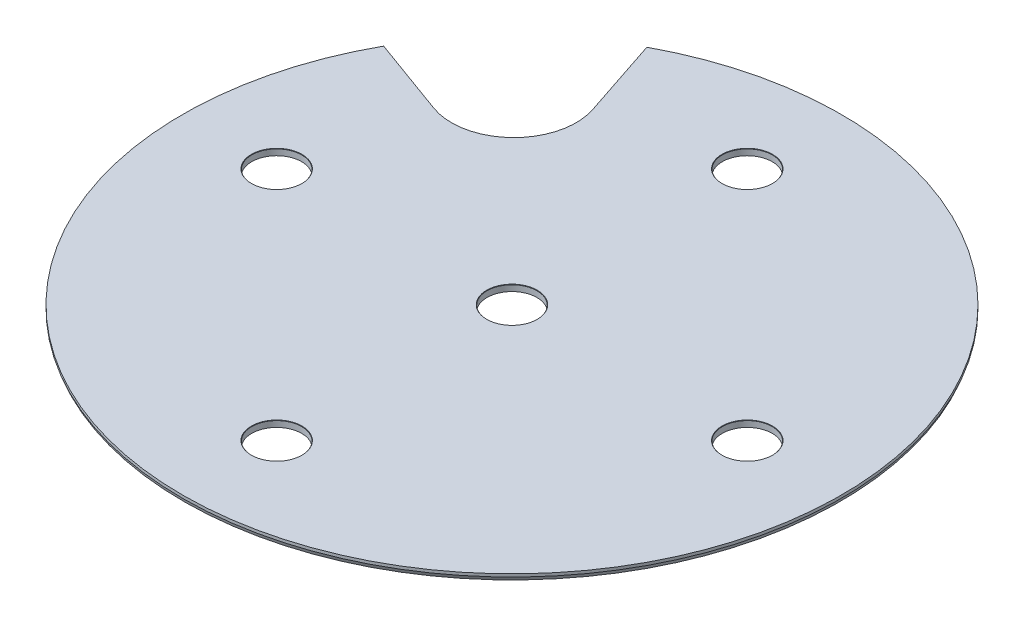
ISO-10303-21;
HEADER;
FILE_DESCRIPTION(('STEP AP214'),'2;1');
FILE_NAME('part.step','',(''),(''),'','','');
FILE_SCHEMA(('AUTOMOTIVE_DESIGN { 1 0 10303 214 1 1 1 1 }'));
ENDSEC;
DATA;
#1=APPLICATION_CONTEXT('core data for automotive mechanical design processes');
#2=APPLICATION_PROTOCOL_DEFINITION('international standard','automotive_design',2000,#1);
#3=PRODUCT_CONTEXT('',#1,'mechanical');
#4=PRODUCT('Part','Part','',(#3));
#5=PRODUCT_RELATED_PRODUCT_CATEGORY('part','',(#4));
#6=PRODUCT_DEFINITION_FORMATION('','',#4);
#7=PRODUCT_DEFINITION_CONTEXT('part definition',#1,'design');
#8=PRODUCT_DEFINITION('design','',#6,#7);
#9=PRODUCT_DEFINITION_SHAPE('','',#8);
#10=(LENGTH_UNIT() NAMED_UNIT(*) SI_UNIT(.MILLI.,.METRE.));
#11=(NAMED_UNIT(*) PLANE_ANGLE_UNIT() SI_UNIT($,.RADIAN.));
#12=(NAMED_UNIT(*) SI_UNIT($,.STERADIAN.) SOLID_ANGLE_UNIT());
#13=UNCERTAINTY_MEASURE_WITH_UNIT(LENGTH_MEASURE(1.E-05),#10,'distance_accuracy_value','');
#14=(GEOMETRIC_REPRESENTATION_CONTEXT(3) GLOBAL_UNCERTAINTY_ASSIGNED_CONTEXT((#13)) GLOBAL_UNIT_ASSIGNED_CONTEXT((#10,
#11,#12)) REPRESENTATION_CONTEXT('',''));
#15=CARTESIAN_POINT('',(0.,0.,0.));
#16=DIRECTION('',(0.,0.,1.));
#17=DIRECTION('',(1.,0.,0.));
#18=AXIS2_PLACEMENT_3D('',#15,#16,#17);
#19=CARTESIAN_POINT('',(0.,0.5,0.));
#20=DIRECTION('',(0.,-1.,0.));
#21=DIRECTION('',(0.,0.,-1.));
#22=AXIS2_PLACEMENT_3D('',#19,#20,#21);
#23=CYLINDRICAL_SURFACE('',#22,26.4);
#24=CARTESIAN_POINT('',(0.,0.5,0.));
#25=DIRECTION('',(0.,1.,0.));
#26=DIRECTION('',(0.,0.,1.));
#27=AXIS2_PLACEMENT_3D('',#24,#25,#26);
#28=CIRCLE('',#27,26.4);
#29=CARTESIAN_POINT('',(-23.0863925837492,0.5,-12.8054081336368));
#30=VERTEX_POINT('',#29);
#31=CARTESIAN_POINT('',(-12.4661036619069,0.5,-23.2713613587729));
#32=VERTEX_POINT('',#31);
#33=EDGE_CURVE('E171',#30,#32,#28,.T.);
#34=ORIENTED_EDGE('',*,*,#33,.F.);
#35=DIRECTION('',(0.,1.,0.));
#36=VECTOR('',#35,1.);
#37=CARTESIAN_POINT('',(-23.0863925837492,0.,-12.8054081336368));
#38=LINE('',#37,#36);
#39=CARTESIAN_POINT('',(-23.0863925837492,0.274747741945441,-12.8054081336368));
#40=VERTEX_POINT('',#39);
#41=EDGE_CURVE('E124',#40,#30,#38,.T.);
#42=ORIENTED_EDGE('',*,*,#41,.F.);
#43=CARTESIAN_POINT('',(0.,0.274747741945441,0.));
#44=DIRECTION('',(0.,1.,0.));
#45=DIRECTION('',(0.,0.,1.));
#46=AXIS2_PLACEMENT_3D('',#43,#44,#45);
#47=CIRCLE('',#46,26.4);
#48=CARTESIAN_POINT('',(-12.4661036619069,0.274747741945441,-23.2713613587729));
#49=VERTEX_POINT('',#48);
#50=EDGE_CURVE('E174',#40,#49,#47,.T.);
#51=ORIENTED_EDGE('',*,*,#50,.T.);
#52=DIRECTION('',(0.,1.,0.));
#53=VECTOR('',#52,1.);
#54=CARTESIAN_POINT('',(-12.4661036619069,0.,-23.2713613587729));
#55=LINE('',#54,#53);
#56=EDGE_CURVE('E62',#49,#32,#55,.T.);
#57=ORIENTED_EDGE('',*,*,#56,.T.);
#58=EDGE_LOOP('',(#34,#42,#51,#57));
#59=FACE_BOUND('',#58,.T.);
#60=ADVANCED_FACE('F40',(#59),#23,.T.);
#61=CARTESIAN_POINT('',(0.,0.5,0.));
#62=DIRECTION('',(0.,1.,0.));
#63=DIRECTION('',(0.,0.,1.));
#64=AXIS2_PLACEMENT_3D('',#61,#62,#63);
#65=PLANE('',#64);
#66=DIRECTION('',(0.939872835093915,0.,0.341524602118979));
#67=VECTOR('',#66,1.);
#68=CARTESIAN_POINT('',(1.41762907674872,0.5,-3.90130330643418));
#69=LINE('',#68,#67);
#70=CARTESIAN_POINT('',(-16.7640237019021,0.5,-10.5080287050608));
#71=VERTEX_POINT('',#70);
#72=EDGE_CURVE('E112',#30,#71,#69,.T.);
#73=ORIENTED_EDGE('',*,*,#72,.F.);
#74=ORIENTED_EDGE('',*,*,#33,.T.);
#75=DIRECTION('',(-0.315197196171202,0.,-0.949026199599259));
#76=VECTOR('',#75,1.);
#77=CARTESIAN_POINT('',(-4.26643376571832,0.5,1.41699771952809));
#78=LINE('',#77,#76);
#79=CARTESIAN_POINT('',(-10.3112696933109,0.5,-16.7833788613863));
#80=VERTEX_POINT('',#79);
#81=EDGE_CURVE('E115',#80,#32,#78,.T.);
#82=ORIENTED_EDGE('',*,*,#81,.F.);
#83=CARTESIAN_POINT('',(-15.0564006913072,0.5,-15.2073928805303));
#84=DIRECTION('',(0.,1.,0.));
#85=DIRECTION('',(0.,0.,1.));
#86=AXIS2_PLACEMENT_3D('',#83,#84,#85);
#87=CIRCLE('',#86,5.);
#88=EDGE_CURVE('E99',#71,#80,#87,.T.);
#89=ORIENTED_EDGE('',*,*,#88,.F.);
#90=EDGE_LOOP('',(#73,#74,#82,#89));
#91=FACE_BOUND('',#90,.T.);
#92=CARTESIAN_POINT('',(-18.85,0.500000000000002,0.));
#93=DIRECTION('',(0.,1.,0.));
#94=DIRECTION('',(0.,0.,1.));
#95=AXIS2_PLACEMENT_3D('',#92,#93,#94);
#96=CIRCLE('',#95,2.025);
#97=CARTESIAN_POINT('',(-18.85,0.500000000000002,2.025));
#98=VERTEX_POINT('',#97);
#99=EDGE_CURVE('E123',#98,#98,#96,.T.);
#100=ORIENTED_EDGE('',*,*,#99,.F.);
#101=EDGE_LOOP('',(#100));
#102=FACE_BOUND('',#101,.T.);
#103=CARTESIAN_POINT('',(0.,0.500000000000002,-18.85));
#104=DIRECTION('',(0.,1.,0.));
#105=DIRECTION('',(0.,0.,1.));
#106=AXIS2_PLACEMENT_3D('',#103,#104,#105);
#107=CIRCLE('',#106,2.025);
#108=CARTESIAN_POINT('',(0.,0.500000000000002,-16.825));
#109=VERTEX_POINT('',#108);
#110=EDGE_CURVE('E135',#109,#109,#107,.T.);
#111=ORIENTED_EDGE('',*,*,#110,.F.);
#112=EDGE_LOOP('',(#111));
#113=FACE_BOUND('',#112,.T.);
#114=CARTESIAN_POINT('',(18.85,0.500000000000002,1.31628846474386E-13));
#115=DIRECTION('',(0.,1.,0.));
#116=DIRECTION('',(0.,0.,1.));
#117=AXIS2_PLACEMENT_3D('',#114,#115,#116);
#118=CIRCLE('',#117,2.025);
#119=CARTESIAN_POINT('',(18.85,0.500000000000002,2.02500000000013));
#120=VERTEX_POINT('',#119);
#121=EDGE_CURVE('E144',#120,#120,#118,.T.);
#122=ORIENTED_EDGE('',*,*,#121,.F.);
#123=EDGE_LOOP('',(#122));
#124=FACE_BOUND('',#123,.T.);
#125=CARTESIAN_POINT('',(-1.97443269711579E-13,0.500000000000002,18.85));
#126=DIRECTION('',(0.,1.,0.));
#127=DIRECTION('',(0.,0.,1.));
#128=AXIS2_PLACEMENT_3D('',#125,#126,#127);
#129=CIRCLE('',#128,2.025);
#130=CARTESIAN_POINT('',(-1.97443269711579E-13,0.500000000000002,20.875));
#131=VERTEX_POINT('',#130);
#132=EDGE_CURVE('E153',#131,#131,#129,.T.);
#133=ORIENTED_EDGE('',*,*,#132,.F.);
#134=EDGE_LOOP('',(#133));
#135=FACE_BOUND('',#134,.T.);
#136=CARTESIAN_POINT('',(0.,0.500000000000002,0.));
#137=DIRECTION('',(0.,1.,0.));
#138=DIRECTION('',(0.,0.,1.));
#139=AXIS2_PLACEMENT_3D('',#136,#137,#138);
#140=CIRCLE('',#139,2.025);
#141=CARTESIAN_POINT('',(0.,0.500000000000002,2.025));
#142=VERTEX_POINT('',#141);
#143=EDGE_CURVE('E162',#142,#142,#140,.T.);
#144=ORIENTED_EDGE('',*,*,#143,.F.);
#145=EDGE_LOOP('',(#144));
#146=FACE_BOUND('',#145,.T.);
#147=ADVANCED_FACE('F230',(#91,#102,#113,#124,#135,#146),#65,.T.);
#148=CARTESIAN_POINT('',(0.,0.,0.));
#149=DIRECTION('',(0.,1.,0.));
#150=DIRECTION('',(0.,0.,1.));
#151=AXIS2_PLACEMENT_3D('',#148,#149,#150);
#152=PLANE('',#151);
#153=CARTESIAN_POINT('',(0.,0.,0.));
#154=DIRECTION('',(0.,1.,0.));
#155=DIRECTION('',(0.,0.,1.));
#156=AXIS2_PLACEMENT_3D('',#153,#154,#155);
#157=CIRCLE('',#156,26.3);
#158=CARTESIAN_POINT('',(-12.434114938519,0.,-23.1750466169045));
#159=VERTEX_POINT('',#158);
#160=CARTESIAN_POINT('',(-22.9912169703702,0.,-12.7708238661945));
#161=VERTEX_POINT('',#160);
#162=EDGE_CURVE('E177',#159,#161,#157,.F.);
#163=ORIENTED_EDGE('',*,*,#162,.T.);
#164=DIRECTION('',(0.939872835093915,0.,0.341524602118979));
#165=VECTOR('',#164,1.);
#166=CARTESIAN_POINT('',(1.41762907674872,0.,-3.90130330643418));
#167=LINE('',#166,#165);
#168=CARTESIAN_POINT('',(-16.7640237019021,0.,-10.5080287050608));
#169=VERTEX_POINT('',#168);
#170=EDGE_CURVE('E101',#161,#169,#167,.T.);
#171=ORIENTED_EDGE('',*,*,#170,.T.);
#172=CARTESIAN_POINT('',(-15.0564006913072,0.,-15.2073928805303));
#173=DIRECTION('',(0.,1.,0.));
#174=DIRECTION('',(0.,0.,1.));
#175=AXIS2_PLACEMENT_3D('',#172,#173,#174);
#176=CIRCLE('',#175,5.);
#177=CARTESIAN_POINT('',(-10.3112696933109,0.,-16.7833788613863));
#178=VERTEX_POINT('',#177);
#179=EDGE_CURVE('E96',#169,#178,#176,.T.);
#180=ORIENTED_EDGE('',*,*,#179,.T.);
#181=DIRECTION('',(-0.315197196171202,0.,-0.949026199599259));
#182=VECTOR('',#181,1.);
#183=CARTESIAN_POINT('',(-4.26643376571832,0.,1.41699771952809));
#184=LINE('',#183,#182);
#185=EDGE_CURVE('E104',#178,#159,#184,.T.);
#186=ORIENTED_EDGE('',*,*,#185,.T.);
#187=EDGE_LOOP('',(#163,#171,#180,#186));
#188=FACE_BOUND('',#187,.T.);
#189=CARTESIAN_POINT('',(-18.85,0.,0.));
#190=DIRECTION('',(0.,1.,0.));
#191=DIRECTION('',(0.,0.,1.));
#192=AXIS2_PLACEMENT_3D('',#189,#190,#191);
#193=CIRCLE('',#192,2.);
#194=CARTESIAN_POINT('',(-18.85,0.,2.));
#195=VERTEX_POINT('',#194);
#196=EDGE_CURVE('E132',#195,#195,#193,.T.);
#197=ORIENTED_EDGE('',*,*,#196,.T.);
#198=EDGE_LOOP('',(#197));
#199=FACE_BOUND('',#198,.T.);
#200=CARTESIAN_POINT('',(0.,0.,-18.85));
#201=DIRECTION('',(0.,1.,0.));
#202=DIRECTION('',(0.,0.,1.));
#203=AXIS2_PLACEMENT_3D('',#200,#201,#202);
#204=CIRCLE('',#203,2.);
#205=CARTESIAN_POINT('',(0.,0.,-16.85));
#206=VERTEX_POINT('',#205);
#207=EDGE_CURVE('E141',#206,#206,#204,.T.);
#208=ORIENTED_EDGE('',*,*,#207,.T.);
#209=EDGE_LOOP('',(#208));
#210=FACE_BOUND('',#209,.T.);
#211=CARTESIAN_POINT('',(18.85,0.,1.31628846474386E-13));
#212=DIRECTION('',(0.,1.,0.));
#213=DIRECTION('',(0.,0.,1.));
#214=AXIS2_PLACEMENT_3D('',#211,#212,#213);
#215=CIRCLE('',#214,2.);
#216=CARTESIAN_POINT('',(18.85,0.,2.00000000000013));
#217=VERTEX_POINT('',#216);
#218=EDGE_CURVE('E150',#217,#217,#215,.T.);
#219=ORIENTED_EDGE('',*,*,#218,.T.);
#220=EDGE_LOOP('',(#219));
#221=FACE_BOUND('',#220,.T.);
#222=CARTESIAN_POINT('',(-1.97443269711579E-13,0.,18.85));
#223=DIRECTION('',(0.,1.,0.));
#224=DIRECTION('',(0.,0.,1.));
#225=AXIS2_PLACEMENT_3D('',#222,#223,#224);
#226=CIRCLE('',#225,2.);
#227=CARTESIAN_POINT('',(-1.97443269711579E-13,0.,20.85));
#228=VERTEX_POINT('',#227);
#229=EDGE_CURVE('E159',#228,#228,#226,.T.);
#230=ORIENTED_EDGE('',*,*,#229,.T.);
#231=EDGE_LOOP('',(#230));
#232=FACE_BOUND('',#231,.T.);
#233=CARTESIAN_POINT('',(0.,0.,0.));
#234=DIRECTION('',(0.,1.,0.));
#235=DIRECTION('',(0.,0.,1.));
#236=AXIS2_PLACEMENT_3D('',#233,#234,#235);
#237=CIRCLE('',#236,2.);
#238=CARTESIAN_POINT('',(0.,0.,2.));
#239=VERTEX_POINT('',#238);
#240=EDGE_CURVE('E168',#239,#239,#237,.T.);
#241=ORIENTED_EDGE('',*,*,#240,.T.);
#242=EDGE_LOOP('',(#241));
#243=FACE_BOUND('',#242,.T.);
#244=ADVANCED_FACE('F110',(#188,#199,#210,#221,#232,#243),#152,.F.);
#245=CARTESIAN_POINT('',(0.,0.5,0.));
#246=DIRECTION('',(0.,1.,0.));
#247=DIRECTION('',(0.,0.,1.));
#248=AXIS2_PLACEMENT_3D('',#245,#246,#247);
#249=CYLINDRICAL_SURFACE('',#248,2.);
#250=ORIENTED_EDGE('',*,*,#240,.F.);
#251=EDGE_LOOP('',(#250));
#252=FACE_BOUND('',#251,.T.);
#253=CARTESIAN_POINT('',(0.,0.472717287473267,0.));
#254=DIRECTION('',(0.,1.,0.));
#255=DIRECTION('',(0.,0.,1.));
#256=AXIS2_PLACEMENT_3D('',#253,#254,#255);
#257=CIRCLE('',#256,2.);
#258=CARTESIAN_POINT('',(0.,0.472717287473267,2.));
#259=VERTEX_POINT('',#258);
#260=EDGE_CURVE('E165',#259,#259,#257,.T.);
#261=ORIENTED_EDGE('',*,*,#260,.T.);
#262=EDGE_LOOP('',(#261));
#263=FACE_BOUND('',#262,.T.);
#264=ADVANCED_FACE('F225',(#252,#263),#249,.F.);
#265=CARTESIAN_POINT('',(0.,0.500000000000002,0.));
#266=DIRECTION('',(0.,1.,0.));
#267=DIRECTION('',(0.,0.,1.));
#268=AXIS2_PLACEMENT_3D('',#265,#266,#267);
#269=CONICAL_SURFACE('',#268,2.025,0.741764932097517);
#270=ORIENTED_EDGE('',*,*,#260,.F.);
#271=EDGE_LOOP('',(#270));
#272=FACE_BOUND('',#271,.T.);
#273=ORIENTED_EDGE('',*,*,#143,.T.);
#274=EDGE_LOOP('',(#273));
#275=FACE_BOUND('',#274,.T.);
#276=ADVANCED_FACE('F221',(#272,#275),#269,.F.);
#277=CARTESIAN_POINT('',(-1.97443269711579E-13,0.5,18.85));
#278=DIRECTION('',(0.,1.,0.));
#279=DIRECTION('',(0.,0.,1.));
#280=AXIS2_PLACEMENT_3D('',#277,#278,#279);
#281=CYLINDRICAL_SURFACE('',#280,2.);
#282=ORIENTED_EDGE('',*,*,#229,.F.);
#283=EDGE_LOOP('',(#282));
#284=FACE_BOUND('',#283,.T.);
#285=CARTESIAN_POINT('',(-1.97443269711579E-13,0.472717287473267,18.85));
#286=DIRECTION('',(0.,1.,0.));
#287=DIRECTION('',(0.,0.,1.));
#288=AXIS2_PLACEMENT_3D('',#285,#286,#287);
#289=CIRCLE('',#288,2.);
#290=CARTESIAN_POINT('',(-1.97443269711579E-13,0.472717287473267,20.85));
#291=VERTEX_POINT('',#290);
#292=EDGE_CURVE('E156',#291,#291,#289,.T.);
#293=ORIENTED_EDGE('',*,*,#292,.T.);
#294=EDGE_LOOP('',(#293));
#295=FACE_BOUND('',#294,.T.);
#296=ADVANCED_FACE('F217',(#284,#295),#281,.F.);
#297=CARTESIAN_POINT('',(-1.97443269711579E-13,0.500000000000002,18.85));
#298=DIRECTION('',(0.,1.,0.));
#299=DIRECTION('',(0.,0.,1.));
#300=AXIS2_PLACEMENT_3D('',#297,#298,#299);
#301=CONICAL_SURFACE('',#300,2.025,0.741764932097517);
#302=ORIENTED_EDGE('',*,*,#292,.F.);
#303=EDGE_LOOP('',(#302));
#304=FACE_BOUND('',#303,.T.);
#305=ORIENTED_EDGE('',*,*,#132,.T.);
#306=EDGE_LOOP('',(#305));
#307=FACE_BOUND('',#306,.T.);
#308=ADVANCED_FACE('F213',(#304,#307),#301,.F.);
#309=CARTESIAN_POINT('',(18.85,0.5,1.31628846474386E-13));
#310=DIRECTION('',(0.,1.,0.));
#311=DIRECTION('',(0.,0.,1.));
#312=AXIS2_PLACEMENT_3D('',#309,#310,#311);
#313=CYLINDRICAL_SURFACE('',#312,2.);
#314=ORIENTED_EDGE('',*,*,#218,.F.);
#315=EDGE_LOOP('',(#314));
#316=FACE_BOUND('',#315,.T.);
#317=CARTESIAN_POINT('',(18.85,0.472717287473267,1.31628846474386E-13));
#318=DIRECTION('',(0.,1.,0.));
#319=DIRECTION('',(0.,0.,1.));
#320=AXIS2_PLACEMENT_3D('',#317,#318,#319);
#321=CIRCLE('',#320,2.);
#322=CARTESIAN_POINT('',(18.85,0.472717287473267,2.00000000000013));
#323=VERTEX_POINT('',#322);
#324=EDGE_CURVE('E147',#323,#323,#321,.T.);
#325=ORIENTED_EDGE('',*,*,#324,.T.);
#326=EDGE_LOOP('',(#325));
#327=FACE_BOUND('',#326,.T.);
#328=ADVANCED_FACE('F209',(#316,#327),#313,.F.);
#329=CARTESIAN_POINT('',(18.85,0.500000000000002,1.31628846474386E-13));
#330=DIRECTION('',(0.,1.,0.));
#331=DIRECTION('',(0.,0.,1.));
#332=AXIS2_PLACEMENT_3D('',#329,#330,#331);
#333=CONICAL_SURFACE('',#332,2.025,0.741764932097483);
#334=ORIENTED_EDGE('',*,*,#324,.F.);
#335=EDGE_LOOP('',(#334));
#336=FACE_BOUND('',#335,.T.);
#337=ORIENTED_EDGE('',*,*,#121,.T.);
#338=EDGE_LOOP('',(#337));
#339=FACE_BOUND('',#338,.T.);
#340=ADVANCED_FACE('F205',(#336,#339),#333,.F.);
#341=CARTESIAN_POINT('',(0.,0.5,-18.85));
#342=DIRECTION('',(0.,1.,0.));
#343=DIRECTION('',(0.,0.,1.));
#344=AXIS2_PLACEMENT_3D('',#341,#342,#343);
#345=CYLINDRICAL_SURFACE('',#344,2.);
#346=ORIENTED_EDGE('',*,*,#207,.F.);
#347=EDGE_LOOP('',(#346));
#348=FACE_BOUND('',#347,.T.);
#349=CARTESIAN_POINT('',(0.,0.472717287473267,-18.85));
#350=DIRECTION('',(0.,1.,0.));
#351=DIRECTION('',(0.,0.,1.));
#352=AXIS2_PLACEMENT_3D('',#349,#350,#351);
#353=CIRCLE('',#352,2.);
#354=CARTESIAN_POINT('',(0.,0.472717287473267,-16.85));
#355=VERTEX_POINT('',#354);
#356=EDGE_CURVE('E138',#355,#355,#353,.T.);
#357=ORIENTED_EDGE('',*,*,#356,.T.);
#358=EDGE_LOOP('',(#357));
#359=FACE_BOUND('',#358,.T.);
#360=ADVANCED_FACE('F201',(#348,#359),#345,.F.);
#361=CARTESIAN_POINT('',(0.,0.500000000000002,-18.85));
#362=DIRECTION('',(0.,1.,0.));
#363=DIRECTION('',(0.,0.,1.));
#364=AXIS2_PLACEMENT_3D('',#361,#362,#363);
#365=CONICAL_SURFACE('',#364,2.025,0.741764932097517);
#366=ORIENTED_EDGE('',*,*,#356,.F.);
#367=EDGE_LOOP('',(#366));
#368=FACE_BOUND('',#367,.T.);
#369=ORIENTED_EDGE('',*,*,#110,.T.);
#370=EDGE_LOOP('',(#369));
#371=FACE_BOUND('',#370,.T.);
#372=ADVANCED_FACE('F197',(#368,#371),#365,.F.);
#373=CARTESIAN_POINT('',(-18.85,0.5,0.));
#374=DIRECTION('',(0.,1.,0.));
#375=DIRECTION('',(0.,0.,1.));
#376=AXIS2_PLACEMENT_3D('',#373,#374,#375);
#377=CYLINDRICAL_SURFACE('',#376,2.);
#378=ORIENTED_EDGE('',*,*,#196,.F.);
#379=EDGE_LOOP('',(#378));
#380=FACE_BOUND('',#379,.T.);
#381=CARTESIAN_POINT('',(-18.85,0.472717287473267,0.));
#382=DIRECTION('',(0.,1.,0.));
#383=DIRECTION('',(0.,0.,1.));
#384=AXIS2_PLACEMENT_3D('',#381,#382,#383);
#385=CIRCLE('',#384,2.);
#386=CARTESIAN_POINT('',(-18.85,0.472717287473267,2.));
#387=VERTEX_POINT('',#386);
#388=EDGE_CURVE('E129',#387,#387,#385,.T.);
#389=ORIENTED_EDGE('',*,*,#388,.T.);
#390=EDGE_LOOP('',(#389));
#391=FACE_BOUND('',#390,.T.);
#392=ADVANCED_FACE('F193',(#380,#391),#377,.F.);
#393=CARTESIAN_POINT('',(-18.85,0.500000000000002,0.));
#394=DIRECTION('',(0.,1.,0.));
#395=DIRECTION('',(0.,0.,1.));
#396=AXIS2_PLACEMENT_3D('',#393,#394,#395);
#397=CONICAL_SURFACE('',#396,2.025,0.741764932097483);
#398=ORIENTED_EDGE('',*,*,#388,.F.);
#399=EDGE_LOOP('',(#398));
#400=FACE_BOUND('',#399,.T.);
#401=ORIENTED_EDGE('',*,*,#99,.T.);
#402=EDGE_LOOP('',(#401));
#403=FACE_BOUND('',#402,.T.);
#404=ADVANCED_FACE('F190',(#400,#403),#397,.F.);
#405=CARTESIAN_POINT('',(0.,0.274747741945441,0.));
#406=DIRECTION('',(0.,1.,0.));
#407=DIRECTION('',(0.,0.,1.));
#408=AXIS2_PLACEMENT_3D('',#405,#406,#407);
#409=CONICAL_SURFACE('',#408,26.4,0.349065850398888);
#410=CARTESIAN_POINT('',(-22.9911476848352,-0.000199999999999867,-12.7707986896878));
#411=CARTESIAN_POINT('',(-23.0070340574331,0.0456576917769583,-12.7765713717762));
#412=CARTESIAN_POINT('',(-23.0229200918781,0.0915155161608932,-12.782343930989));
#413=CARTESIAN_POINT('',(-23.0546914844625,0.183231430142706,-12.7938888036633));
#414=CARTESIAN_POINT('',(-23.0705768426019,0.229089519740583,-12.7996611171248));
#415=CARTESIAN_POINT('',(-23.0864618625884,0.274947741945438,-12.8054333077105));
#416=B_SPLINE_CURVE_WITH_KNOTS('',3,(#410,#411,#412,#413,#414,#415),.UNSPECIFIED.,.F.,.F.,(4,2,
4),(0.,0.146620794184644,0.293241588369254),.UNSPECIFIED.);
#417=EDGE_CURVE('E11',#161,#40,#416,.T.);
#418=ORIENTED_EDGE('',*,*,#417,.F.);
#419=ORIENTED_EDGE('',*,*,#162,.F.);
#420=CARTESIAN_POINT('',(-12.4661269464701,0.274947741945441,-23.2714314661876));
#421=CARTESIAN_POINT('',(-12.460787998275,0.229089471271482,-23.255356444655));
#422=CARTESIAN_POINT('',(-12.455448916247,0.183231357439053,-23.2392810201654));
#423=CARTESIAN_POINT('',(-12.4447704845251,0.0915154434572385,-23.2071293652718));
#424=CARTESIAN_POINT('',(-12.4394311348312,0.0456576433078536,-23.1910531348679));
#425=CARTESIAN_POINT('',(-12.4340916513044,-0.000200000000001592,-23.1749765015069));
#426=B_SPLINE_CURVE_WITH_KNOTS('',3,(#420,#421,#422,#423,#424,#425),.UNSPECIFIED.,.F.,.F.,(4,2,
4),(0.,0.146659554967386,0.293319109934821),.UNSPECIFIED.);
#427=EDGE_CURVE('E55',#49,#159,#426,.T.);
#428=ORIENTED_EDGE('',*,*,#427,.F.);
#429=ORIENTED_EDGE('',*,*,#50,.F.);
#430=EDGE_LOOP('',(#418,#419,#428,#429));
#431=FACE_BOUND('',#430,.T.);
#432=ADVANCED_FACE('F43',(#431),#409,.T.);
#433=CARTESIAN_POINT('',(-15.0564006913072,0.,-15.2073928805303));
#434=DIRECTION('',(0.,1.,0.));
#435=DIRECTION('',(0.,0.,1.));
#436=AXIS2_PLACEMENT_3D('',#433,#434,#435);
#437=CYLINDRICAL_SURFACE('',#436,5.);
#438=ORIENTED_EDGE('',*,*,#88,.T.);
#439=DIRECTION('',(0.,1.,0.));
#440=VECTOR('',#439,1.);
#441=CARTESIAN_POINT('',(-10.3112696933109,0.,-16.7833788613863));
#442=LINE('',#441,#440);
#443=EDGE_CURVE('E92',#178,#80,#442,.T.);
#444=ORIENTED_EDGE('',*,*,#443,.F.);
#445=ORIENTED_EDGE('',*,*,#179,.F.);
#446=DIRECTION('',(0.,1.,0.));
#447=VECTOR('',#446,1.);
#448=CARTESIAN_POINT('',(-16.7640237019021,0.,-10.5080287050608));
#449=LINE('',#448,#447);
#450=EDGE_CURVE('E121',#169,#71,#449,.T.);
#451=ORIENTED_EDGE('',*,*,#450,.T.);
#452=EDGE_LOOP('',(#438,#444,#445,#451));
#453=FACE_BOUND('',#452,.T.);
#454=ADVANCED_FACE('F94',(#453),#437,.F.);
#455=CARTESIAN_POINT('',(1.41762907674872,0.,-3.90130330643418));
#456=DIRECTION('',(-0.341524602118979,0.,0.939872835093915));
#457=DIRECTION('',(0.939872835093915,0.,0.341524602118979));
#458=AXIS2_PLACEMENT_3D('',#455,#456,#457);
#459=PLANE('',#458);
#460=ORIENTED_EDGE('',*,*,#417,.T.);
#461=ORIENTED_EDGE('',*,*,#41,.T.);
#462=ORIENTED_EDGE('',*,*,#72,.T.);
#463=ORIENTED_EDGE('',*,*,#450,.F.);
#464=ORIENTED_EDGE('',*,*,#170,.F.);
#465=EDGE_LOOP('',(#460,#461,#462,#463,#464));
#466=FACE_BOUND('',#465,.T.);
#467=ADVANCED_FACE('F186',(#466),#459,.F.);
#468=CARTESIAN_POINT('',(-4.26643376571832,0.,1.41699771952809));
#469=DIRECTION('',(0.949026199599259,0.,-0.315197196171202));
#470=DIRECTION('',(-0.315197196171202,0.,-0.949026199599259));
#471=AXIS2_PLACEMENT_3D('',#468,#469,#470);
#472=PLANE('',#471);
#473=ORIENTED_EDGE('',*,*,#427,.T.);
#474=ORIENTED_EDGE('',*,*,#185,.F.);
#475=ORIENTED_EDGE('',*,*,#443,.T.);
#476=ORIENTED_EDGE('',*,*,#81,.T.);
#477=ORIENTED_EDGE('',*,*,#56,.F.);
#478=EDGE_LOOP('',(#473,#474,#475,#476,#477));
#479=FACE_BOUND('',#478,.T.);
#480=ADVANCED_FACE('F105',(#479),#472,.F.);
#481=CLOSED_SHELL('',(#60,#147,#244,#264,#276,#296,#308,#328,#340,#360,#372,#392,#404,#432,#454,
#467,#480));
#482=MANIFOLD_SOLID_BREP('B2',#481);
#483=ADVANCED_BREP_SHAPE_REPRESENTATION('',(#18,#482),#14);
#484=SHAPE_DEFINITION_REPRESENTATION(#9,#483);
ENDSEC;
END-ISO-10303-21;
